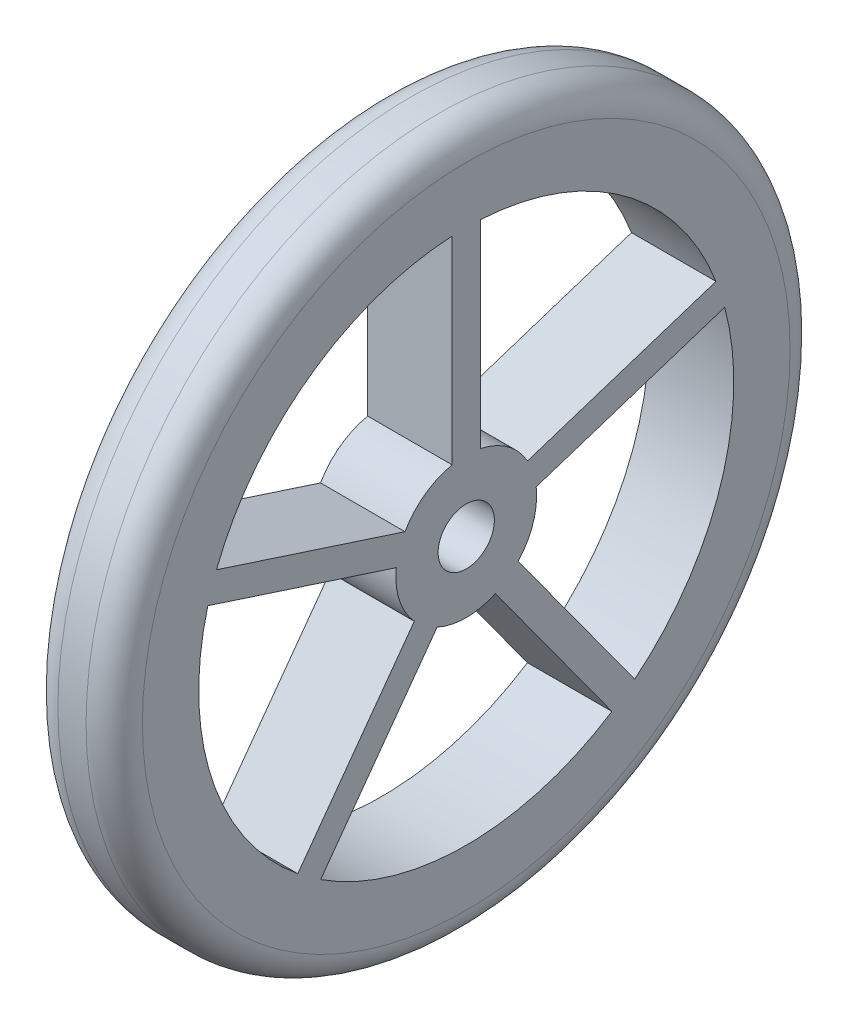
ISO-10303-21;
HEADER;
FILE_DESCRIPTION(('STEP AP214'),'2;1');
FILE_NAME('part.step','',(''),(''),'','','');
FILE_SCHEMA(('AUTOMOTIVE_DESIGN { 1 0 10303 214 1 1 1 1 }'));
ENDSEC;
DATA;
#1=APPLICATION_CONTEXT('core data for automotive mechanical design processes');
#2=APPLICATION_PROTOCOL_DEFINITION('international standard','automotive_design',2000,#1);
#3=PRODUCT_CONTEXT('',#1,'mechanical');
#4=PRODUCT('Part','Part','',(#3));
#5=PRODUCT_RELATED_PRODUCT_CATEGORY('part','',(#4));
#6=PRODUCT_DEFINITION_FORMATION('','',#4);
#7=PRODUCT_DEFINITION_CONTEXT('part definition',#1,'design');
#8=PRODUCT_DEFINITION('design','',#6,#7);
#9=PRODUCT_DEFINITION_SHAPE('','',#8);
#10=(LENGTH_UNIT() NAMED_UNIT(*) SI_UNIT(.MILLI.,.METRE.));
#11=(NAMED_UNIT(*) PLANE_ANGLE_UNIT() SI_UNIT($,.RADIAN.));
#12=(NAMED_UNIT(*) SI_UNIT($,.STERADIAN.) SOLID_ANGLE_UNIT());
#13=UNCERTAINTY_MEASURE_WITH_UNIT(LENGTH_MEASURE(1.E-05),#10,'distance_accuracy_value','');
#14=(GEOMETRIC_REPRESENTATION_CONTEXT(3) GLOBAL_UNCERTAINTY_ASSIGNED_CONTEXT((#13)) GLOBAL_UNIT_ASSIGNED_CONTEXT((#10,
#11,#12)) REPRESENTATION_CONTEXT('',''));
#15=CARTESIAN_POINT('',(0.,0.,0.));
#16=DIRECTION('',(0.,0.,1.));
#17=DIRECTION('',(1.,0.,0.));
#18=AXIS2_PLACEMENT_3D('',#15,#16,#17);
#19=CARTESIAN_POINT('',(60.,0.,0.));
#20=DIRECTION('',(1.,0.,0.));
#21=DIRECTION('',(0.,0.,-1.));
#22=AXIS2_PLACEMENT_3D('',#19,#20,#21);
#23=PLANE('',#22);
#24=CARTESIAN_POINT('',(60.,0.,0.));
#25=DIRECTION('',(1.,0.,0.));
#26=DIRECTION('',(0.,0.,-1.));
#27=AXIS2_PLACEMENT_3D('',#24,#25,#26);
#28=CIRCLE('',#27,230.);
#29=CARTESIAN_POINT('',(60.,0.,-230.));
#30=VERTEX_POINT('',#29);
#31=EDGE_CURVE('E11',#30,#30,#28,.T.);
#32=ORIENTED_EDGE('',*,*,#31,.T.);
#33=EDGE_LOOP('',(#32));
#34=FACE_BOUND('',#33,.T.);
#35=CARTESIAN_POINT('',(60.,0.,0.));
#36=DIRECTION('',(1.,0.,0.));
#37=DIRECTION('',(0.,0.,-1.));
#38=AXIS2_PLACEMENT_3D('',#35,#36,#37);
#39=CIRCLE('',#38,20.);
#40=CARTESIAN_POINT('',(60.,0.,-20.));
#41=VERTEX_POINT('',#40);
#42=EDGE_CURVE('E330',#41,#41,#39,.T.);
#43=ORIENTED_EDGE('',*,*,#42,.F.);
#44=EDGE_LOOP('',(#43));
#45=FACE_BOUND('',#44,.T.);
#46=DIRECTION('',(0.,0.309016994374948,-0.951056516295153));
#47=VECTOR('',#46,1.);
#48=CARTESIAN_POINT('',(60.,68.1424174384113,-177.360116558513));
#49=LINE('',#48,#47);
#50=CARTESIAN_POINT('',(60.,24.6492443242971,-43.5018936856903));
#51=VERTEX_POINT('',#50);
#52=CARTESIAN_POINT('',(60.,68.1424174384113,-177.360116558513));
#53=VERTEX_POINT('',#52);
#54=EDGE_CURVE('E301',#51,#53,#49,.T.);
#55=ORIENTED_EDGE('',*,*,#54,.F.);
#56=CARTESIAN_POINT('',(60.,0.,0.));
#57=DIRECTION('',(-1.,0.,0.));
#58=DIRECTION('',(0.,0.,-1.));
#59=AXIS2_PLACEMENT_3D('',#56,#57,#58);
#60=CIRCLE('',#59,50.);
#61=CARTESIAN_POINT('',(60.,48.9897948556636,-10.));
#62=VERTEX_POINT('',#61);
#63=EDGE_CURVE('E299',#62,#51,#60,.T.);
#64=ORIENTED_EDGE('',*,*,#63,.F.);
#65=DIRECTION('',(0.,-1.,0.));
#66=VECTOR('',#65,1.);
#67=CARTESIAN_POINT('',(60.,189.736659610103,-9.99999999999998));
#68=LINE('',#67,#66);
#69=CARTESIAN_POINT('',(60.,189.736659610103,-9.99999999999998));
#70=VERTEX_POINT('',#69);
#71=EDGE_CURVE('E307',#70,#62,#68,.T.);
#72=ORIENTED_EDGE('',*,*,#71,.F.);
#73=CARTESIAN_POINT('',(60.,0.,0.));
#74=DIRECTION('',(1.,0.,0.));
#75=DIRECTION('',(0.,0.,-1.));
#76=AXIS2_PLACEMENT_3D('',#73,#74,#75);
#77=CIRCLE('',#76,190.);
#78=EDGE_CURVE('E304',#53,#70,#77,.T.);
#79=ORIENTED_EDGE('',*,*,#78,.F.);
#80=EDGE_LOOP('',(#55,#64,#72,#79));
#81=FACE_BOUND('',#80,.T.);
#82=DIRECTION('',(0.,1.,0.));
#83=VECTOR('',#82,1.);
#84=CARTESIAN_POINT('',(60.,189.736659610103,10.));
#85=LINE('',#84,#83);
#86=CARTESIAN_POINT('',(60.,48.9897948556636,10.));
#87=VERTEX_POINT('',#86);
#88=CARTESIAN_POINT('',(60.,189.736659610103,10.));
#89=VERTEX_POINT('',#88);
#90=EDGE_CURVE('E270',#87,#89,#85,.T.);
#91=ORIENTED_EDGE('',*,*,#90,.F.);
#92=CARTESIAN_POINT('',(60.,0.,0.));
#93=DIRECTION('',(-1.,0.,0.));
#94=DIRECTION('',(0.,0.,-1.));
#95=AXIS2_PLACEMENT_3D('',#92,#93,#94);
#96=CIRCLE('',#95,50.);
#97=CARTESIAN_POINT('',(60.,24.6492443242939,43.5018936856922));
#98=VERTEX_POINT('',#97);
#99=EDGE_CURVE('E268',#98,#87,#96,.T.);
#100=ORIENTED_EDGE('',*,*,#99,.F.);
#101=DIRECTION('',(0.,-0.309016994374947,-0.951056516295154));
#102=VECTOR('',#101,1.);
#103=CARTESIAN_POINT('',(60.,68.1424174384079,177.360116558514));
#104=LINE('',#103,#102);
#105=CARTESIAN_POINT('',(60.,68.1424174384079,177.360116558514));
#106=VERTEX_POINT('',#105);
#107=EDGE_CURVE('E276',#106,#98,#104,.T.);
#108=ORIENTED_EDGE('',*,*,#107,.F.);
#109=CARTESIAN_POINT('',(60.,0.,0.));
#110=DIRECTION('',(1.,0.,0.));
#111=DIRECTION('',(0.,0.,-1.));
#112=AXIS2_PLACEMENT_3D('',#109,#110,#111);
#113=CIRCLE('',#112,190.);
#114=EDGE_CURVE('E273',#89,#106,#113,.T.);
#115=ORIENTED_EDGE('',*,*,#114,.F.);
#116=EDGE_LOOP('',(#91,#100,#108,#115));
#117=FACE_BOUND('',#116,.T.);
#118=DIRECTION('',(0.,-0.809016994374947,-0.587785252292473));
#119=VECTOR('',#118,1.);
#120=CARTESIAN_POINT('',(60.,-147.622329557581,-119.614580281808));
#121=LINE('',#120,#119);
#122=CARTESIAN_POINT('',(60.,-33.7557240662468,-36.8856488727447));
#123=VERTEX_POINT('',#122);
#124=CARTESIAN_POINT('',(60.,-147.622329557581,-119.614580281808));
#125=VERTEX_POINT('',#124);
#126=EDGE_CURVE('E239',#123,#125,#121,.T.);
#127=ORIENTED_EDGE('',*,*,#126,.F.);
#128=CARTESIAN_POINT('',(60.,0.,0.));
#129=DIRECTION('',(-1.,0.,0.));
#130=DIRECTION('',(0.,0.,-1.));
#131=AXIS2_PLACEMENT_3D('',#128,#129,#130);
#132=CIRCLE('',#131,50.);
#133=CARTESIAN_POINT('',(60.,5.62811399839088,-49.6822335731911));
#134=VERTEX_POINT('',#133);
#135=EDGE_CURVE('E237',#134,#123,#132,.T.);
#136=ORIENTED_EDGE('',*,*,#135,.F.);
#137=DIRECTION('',(0.,-0.309016994374948,0.951056516295154));
#138=VECTOR('',#137,1.);
#139=CARTESIAN_POINT('',(60.,49.1212871125049,-183.540456446013));
#140=LINE('',#139,#138);
#141=CARTESIAN_POINT('',(60.,49.1212871125049,-183.540456446013));
#142=VERTEX_POINT('',#141);
#143=EDGE_CURVE('E245',#142,#134,#140,.T.);
#144=ORIENTED_EDGE('',*,*,#143,.F.);
#145=CARTESIAN_POINT('',(60.,0.,0.));
#146=DIRECTION('',(1.,0.,0.));
#147=DIRECTION('',(0.,0.,-1.));
#148=AXIS2_PLACEMENT_3D('',#145,#146,#147);
#149=CIRCLE('',#148,190.);
#150=EDGE_CURVE('E242',#125,#142,#149,.T.);
#151=ORIENTED_EDGE('',*,*,#150,.F.);
#152=EDGE_LOOP('',(#127,#136,#144,#151));
#153=FACE_BOUND('',#152,.T.);
#154=DIRECTION('',(0.,-0.809016994374948,0.587785252292473));
#155=VECTOR('',#154,1.);
#156=CARTESIAN_POINT('',(60.,-159.378034603435,103.434240394303));
#157=LINE('',#156,#155);
#158=CARTESIAN_POINT('',(60.,-45.5114291121005,20.7053089852399));
#159=VERTEX_POINT('',#158);
#160=CARTESIAN_POINT('',(60.,-159.378034603434,103.434240394303));
#161=VERTEX_POINT('',#160);
#162=EDGE_CURVE('E208',#159,#161,#157,.T.);
#163=ORIENTED_EDGE('',*,*,#162,.F.);
#164=CARTESIAN_POINT('',(60.,0.,0.));
#165=DIRECTION('',(-1.,0.,0.));
#166=DIRECTION('',(0.,0.,-1.));
#167=AXIS2_PLACEMENT_3D('',#164,#165,#166);
#168=CIRCLE('',#167,50.);
#169=CARTESIAN_POINT('',(60.,-45.5114291120989,-20.7053089852432));
#170=VERTEX_POINT('',#169);
#171=EDGE_CURVE('E206',#170,#159,#168,.T.);
#172=ORIENTED_EDGE('',*,*,#171,.F.);
#173=DIRECTION('',(0.,0.809016994374947,0.587785252292473));
#174=VECTOR('',#173,1.);
#175=CARTESIAN_POINT('',(60.,-159.378034603432,-103.434240394306));
#176=LINE('',#175,#174);
#177=CARTESIAN_POINT('',(60.,-159.378034603432,-103.434240394306));
#178=VERTEX_POINT('',#177);
#179=EDGE_CURVE('E214',#178,#170,#176,.T.);
#180=ORIENTED_EDGE('',*,*,#179,.F.);
#181=CARTESIAN_POINT('',(60.,0.,0.));
#182=DIRECTION('',(1.,0.,0.));
#183=DIRECTION('',(0.,0.,-1.));
#184=AXIS2_PLACEMENT_3D('',#181,#182,#183);
#185=CIRCLE('',#184,190.);
#186=EDGE_CURVE('E211',#161,#178,#185,.T.);
#187=ORIENTED_EDGE('',*,*,#186,.F.);
#188=EDGE_LOOP('',(#163,#172,#180,#187));
#189=FACE_BOUND('',#188,.T.);
#190=DIRECTION('',(0.,0.309016994374947,0.951056516295154));
#191=VECTOR('',#190,1.);
#192=CARTESIAN_POINT('',(60.,49.1212871125014,183.540456446014));
#193=LINE('',#192,#191);
#194=CARTESIAN_POINT('',(60.,5.62811399838723,49.6822335731915));
#195=VERTEX_POINT('',#194);
#196=CARTESIAN_POINT('',(60.,49.1212871125014,183.540456446014));
#197=VERTEX_POINT('',#196);
#198=EDGE_CURVE('E178',#195,#197,#193,.T.);
#199=ORIENTED_EDGE('',*,*,#198,.F.);
#200=CARTESIAN_POINT('',(60.,0.,0.));
#201=DIRECTION('',(-1.,0.,0.));
#202=DIRECTION('',(0.,0.,-1.));
#203=AXIS2_PLACEMENT_3D('',#200,#201,#202);
#204=CIRCLE('',#203,50.);
#205=CARTESIAN_POINT('',(60.,-33.7557240662495,36.8856488727422));
#206=VERTEX_POINT('',#205);
#207=EDGE_CURVE('E170',#206,#195,#204,.T.);
#208=ORIENTED_EDGE('',*,*,#207,.F.);
#209=DIRECTION('',(0.,0.809016994374948,-0.587785252292473));
#210=VECTOR('',#209,1.);
#211=CARTESIAN_POINT('',(60.,-147.622329557583,119.614580281805));
#212=LINE('',#211,#210);
#213=CARTESIAN_POINT('',(60.,-147.622329557583,119.614580281805));
#214=VERTEX_POINT('',#213);
#215=EDGE_CURVE('E192',#214,#206,#212,.T.);
#216=ORIENTED_EDGE('',*,*,#215,.F.);
#217=CARTESIAN_POINT('',(60.,0.,0.));
#218=DIRECTION('',(1.,0.,0.));
#219=DIRECTION('',(0.,0.,-1.));
#220=AXIS2_PLACEMENT_3D('',#217,#218,#219);
#221=CIRCLE('',#220,190.);
#222=EDGE_CURVE('E190',#197,#214,#221,.T.);
#223=ORIENTED_EDGE('',*,*,#222,.F.);
#224=EDGE_LOOP('',(#199,#208,#216,#223));
#225=FACE_BOUND('',#224,.T.);
#226=ADVANCED_FACE('F33',(#34,#45,#81,#117,#153,#189,#225),#23,.T.);
#227=CARTESIAN_POINT('',(0.,0.,0.));
#228=DIRECTION('',(1.,0.,0.));
#229=DIRECTION('',(0.,0.,-1.));
#230=AXIS2_PLACEMENT_3D('',#227,#228,#229);
#231=PLANE('',#230);
#232=CARTESIAN_POINT('',(0.,0.,0.));
#233=DIRECTION('',(1.,0.,0.));
#234=DIRECTION('',(0.,0.,-1.));
#235=AXIS2_PLACEMENT_3D('',#232,#233,#234);
#236=CIRCLE('',#235,230.);
#237=CARTESIAN_POINT('',(0.,0.,-230.));
#238=VERTEX_POINT('',#237);
#239=EDGE_CURVE('E41',#238,#238,#236,.F.);
#240=ORIENTED_EDGE('',*,*,#239,.T.);
#241=EDGE_LOOP('',(#240));
#242=FACE_BOUND('',#241,.T.);
#243=CARTESIAN_POINT('',(0.,0.,0.));
#244=DIRECTION('',(-1.,0.,0.));
#245=DIRECTION('',(0.,0.,-1.));
#246=AXIS2_PLACEMENT_3D('',#243,#244,#245);
#247=CIRCLE('',#246,50.);
#248=CARTESIAN_POINT('',(0.,-45.5114291120989,-20.7053089852432));
#249=VERTEX_POINT('',#248);
#250=CARTESIAN_POINT('',(0.,-45.5114291121005,20.7053089852399));
#251=VERTEX_POINT('',#250);
#252=EDGE_CURVE('E186',#249,#251,#247,.T.);
#253=ORIENTED_EDGE('',*,*,#252,.T.);
#254=DIRECTION('',(0.,-0.809016994374948,0.587785252292473));
#255=VECTOR('',#254,1.);
#256=CARTESIAN_POINT('',(0.,-159.378034603435,103.434240394303));
#257=LINE('',#256,#255);
#258=CARTESIAN_POINT('',(0.,-159.378034603434,103.434240394303));
#259=VERTEX_POINT('',#258);
#260=EDGE_CURVE('E219',#251,#259,#257,.T.);
#261=ORIENTED_EDGE('',*,*,#260,.T.);
#262=CARTESIAN_POINT('',(0.,0.,0.));
#263=DIRECTION('',(1.,0.,0.));
#264=DIRECTION('',(0.,0.,-1.));
#265=AXIS2_PLACEMENT_3D('',#262,#263,#264);
#266=CIRCLE('',#265,190.);
#267=CARTESIAN_POINT('',(0.,-159.378034603432,-103.434240394306));
#268=VERTEX_POINT('',#267);
#269=EDGE_CURVE('E222',#259,#268,#266,.T.);
#270=ORIENTED_EDGE('',*,*,#269,.T.);
#271=DIRECTION('',(0.,0.809016994374947,0.587785252292473));
#272=VECTOR('',#271,1.);
#273=CARTESIAN_POINT('',(0.,-159.378034603432,-103.434240394306));
#274=LINE('',#273,#272);
#275=EDGE_CURVE('E209',#268,#249,#274,.T.);
#276=ORIENTED_EDGE('',*,*,#275,.T.);
#277=EDGE_LOOP('',(#253,#261,#270,#276));
#278=FACE_BOUND('',#277,.T.);
#279=CARTESIAN_POINT('',(0.,0.,0.));
#280=DIRECTION('',(-1.,0.,0.));
#281=DIRECTION('',(0.,0.,-1.));
#282=AXIS2_PLACEMENT_3D('',#279,#280,#281);
#283=CIRCLE('',#282,50.);
#284=CARTESIAN_POINT('',(0.,24.6492443242939,43.5018936856922));
#285=VERTEX_POINT('',#284);
#286=CARTESIAN_POINT('',(0.,48.9897948556636,10.));
#287=VERTEX_POINT('',#286);
#288=EDGE_CURVE('E267',#285,#287,#283,.T.);
#289=ORIENTED_EDGE('',*,*,#288,.T.);
#290=DIRECTION('',(0.,1.,0.));
#291=VECTOR('',#290,1.);
#292=CARTESIAN_POINT('',(0.,189.736659610103,10.));
#293=LINE('',#292,#291);
#294=CARTESIAN_POINT('',(0.,189.736659610103,10.));
#295=VERTEX_POINT('',#294);
#296=EDGE_CURVE('E281',#287,#295,#293,.T.);
#297=ORIENTED_EDGE('',*,*,#296,.T.);
#298=CARTESIAN_POINT('',(0.,0.,0.));
#299=DIRECTION('',(1.,0.,0.));
#300=DIRECTION('',(0.,0.,-1.));
#301=AXIS2_PLACEMENT_3D('',#298,#299,#300);
#302=CIRCLE('',#301,190.);
#303=CARTESIAN_POINT('',(0.,68.142417438408,177.360116558514));
#304=VERTEX_POINT('',#303);
#305=EDGE_CURVE('E284',#295,#304,#302,.T.);
#306=ORIENTED_EDGE('',*,*,#305,.T.);
#307=DIRECTION('',(0.,-0.309016994374947,-0.951056516295154));
#308=VECTOR('',#307,1.);
#309=CARTESIAN_POINT('',(0.,68.1424174384079,177.360116558514));
#310=LINE('',#309,#308);
#311=EDGE_CURVE('E271',#304,#285,#310,.T.);
#312=ORIENTED_EDGE('',*,*,#311,.T.);
#313=EDGE_LOOP('',(#289,#297,#306,#312));
#314=FACE_BOUND('',#313,.T.);
#315=CARTESIAN_POINT('',(0.,0.,0.));
#316=DIRECTION('',(1.,0.,0.));
#317=DIRECTION('',(0.,0.,-1.));
#318=AXIS2_PLACEMENT_3D('',#315,#316,#317);
#319=CIRCLE('',#318,20.);
#320=CARTESIAN_POINT('',(0.,0.,-20.));
#321=VERTEX_POINT('',#320);
#322=EDGE_CURVE('E329',#321,#321,#319,.T.);
#323=ORIENTED_EDGE('',*,*,#322,.T.);
#324=EDGE_LOOP('',(#323));
#325=FACE_BOUND('',#324,.T.);
#326=CARTESIAN_POINT('',(0.,0.,0.));
#327=DIRECTION('',(-1.,0.,0.));
#328=DIRECTION('',(0.,0.,-1.));
#329=AXIS2_PLACEMENT_3D('',#326,#327,#328);
#330=CIRCLE('',#329,50.);
#331=CARTESIAN_POINT('',(0.,48.9897948556636,-10.));
#332=VERTEX_POINT('',#331);
#333=CARTESIAN_POINT('',(0.,24.6492443242971,-43.5018936856903));
#334=VERTEX_POINT('',#333);
#335=EDGE_CURVE('E298',#332,#334,#330,.T.);
#336=ORIENTED_EDGE('',*,*,#335,.T.);
#337=DIRECTION('',(0.,0.309016994374948,-0.951056516295153));
#338=VECTOR('',#337,1.);
#339=CARTESIAN_POINT('',(0.,68.1424174384113,-177.360116558513));
#340=LINE('',#339,#338);
#341=CARTESIAN_POINT('',(0.,68.1424174384113,-177.360116558513));
#342=VERTEX_POINT('',#341);
#343=EDGE_CURVE('E312',#334,#342,#340,.T.);
#344=ORIENTED_EDGE('',*,*,#343,.T.);
#345=CARTESIAN_POINT('',(0.,0.,0.));
#346=DIRECTION('',(1.,0.,0.));
#347=DIRECTION('',(0.,0.,-1.));
#348=AXIS2_PLACEMENT_3D('',#345,#346,#347);
#349=CIRCLE('',#348,190.);
#350=CARTESIAN_POINT('',(0.,189.736659610103,-9.99999999999998));
#351=VERTEX_POINT('',#350);
#352=EDGE_CURVE('E315',#342,#351,#349,.T.);
#353=ORIENTED_EDGE('',*,*,#352,.T.);
#354=DIRECTION('',(0.,-1.,0.));
#355=VECTOR('',#354,1.);
#356=CARTESIAN_POINT('',(0.,189.736659610103,-9.99999999999998));
#357=LINE('',#356,#355);
#358=EDGE_CURVE('E302',#351,#332,#357,.T.);
#359=ORIENTED_EDGE('',*,*,#358,.T.);
#360=EDGE_LOOP('',(#336,#344,#353,#359));
#361=FACE_BOUND('',#360,.T.);
#362=CARTESIAN_POINT('',(0.,0.,0.));
#363=DIRECTION('',(-1.,0.,0.));
#364=DIRECTION('',(0.,0.,-1.));
#365=AXIS2_PLACEMENT_3D('',#362,#363,#364);
#366=CIRCLE('',#365,50.);
#367=CARTESIAN_POINT('',(0.,5.62811399839088,-49.6822335731911));
#368=VERTEX_POINT('',#367);
#369=CARTESIAN_POINT('',(0.,-33.7557240662468,-36.8856488727447));
#370=VERTEX_POINT('',#369);
#371=EDGE_CURVE('E236',#368,#370,#366,.T.);
#372=ORIENTED_EDGE('',*,*,#371,.T.);
#373=DIRECTION('',(0.,-0.809016994374947,-0.587785252292473));
#374=VECTOR('',#373,1.);
#375=CARTESIAN_POINT('',(0.,-147.622329557581,-119.614580281808));
#376=LINE('',#375,#374);
#377=CARTESIAN_POINT('',(0.,-147.622329557581,-119.614580281808));
#378=VERTEX_POINT('',#377);
#379=EDGE_CURVE('E250',#370,#378,#376,.T.);
#380=ORIENTED_EDGE('',*,*,#379,.T.);
#381=CARTESIAN_POINT('',(0.,0.,0.));
#382=DIRECTION('',(1.,0.,0.));
#383=DIRECTION('',(0.,0.,-1.));
#384=AXIS2_PLACEMENT_3D('',#381,#382,#383);
#385=CIRCLE('',#384,190.);
#386=CARTESIAN_POINT('',(0.,49.1212871125049,-183.540456446013));
#387=VERTEX_POINT('',#386);
#388=EDGE_CURVE('E253',#378,#387,#385,.T.);
#389=ORIENTED_EDGE('',*,*,#388,.T.);
#390=DIRECTION('',(0.,-0.309016994374948,0.951056516295154));
#391=VECTOR('',#390,1.);
#392=CARTESIAN_POINT('',(0.,49.1212871125049,-183.540456446013));
#393=LINE('',#392,#391);
#394=EDGE_CURVE('E240',#387,#368,#393,.T.);
#395=ORIENTED_EDGE('',*,*,#394,.T.);
#396=EDGE_LOOP('',(#372,#380,#389,#395));
#397=FACE_BOUND('',#396,.T.);
#398=CARTESIAN_POINT('',(0.,0.,0.));
#399=DIRECTION('',(-1.,0.,0.));
#400=DIRECTION('',(0.,0.,-1.));
#401=AXIS2_PLACEMENT_3D('',#398,#399,#400);
#402=CIRCLE('',#401,50.);
#403=CARTESIAN_POINT('',(0.,-33.7557240662495,36.8856488727422));
#404=VERTEX_POINT('',#403);
#405=CARTESIAN_POINT('',(0.,5.62811399838723,49.6822335731915));
#406=VERTEX_POINT('',#405);
#407=EDGE_CURVE('E56',#404,#406,#402,.T.);
#408=ORIENTED_EDGE('',*,*,#407,.T.);
#409=DIRECTION('',(0.,0.309016994374947,0.951056516295154));
#410=VECTOR('',#409,1.);
#411=CARTESIAN_POINT('',(0.,49.1212871125014,183.540456446014));
#412=LINE('',#411,#410);
#413=CARTESIAN_POINT('',(0.,49.1212871125014,183.540456446014));
#414=VERTEX_POINT('',#413);
#415=EDGE_CURVE('E185',#406,#414,#412,.T.);
#416=ORIENTED_EDGE('',*,*,#415,.T.);
#417=CARTESIAN_POINT('',(0.,0.,0.));
#418=DIRECTION('',(1.,0.,0.));
#419=DIRECTION('',(0.,0.,-1.));
#420=AXIS2_PLACEMENT_3D('',#417,#418,#419);
#421=CIRCLE('',#420,190.);
#422=CARTESIAN_POINT('',(0.,-147.622329557583,119.614580281805));
#423=VERTEX_POINT('',#422);
#424=EDGE_CURVE('E198',#414,#423,#421,.T.);
#425=ORIENTED_EDGE('',*,*,#424,.T.);
#426=DIRECTION('',(0.,0.809016994374948,-0.587785252292473));
#427=VECTOR('',#426,1.);
#428=CARTESIAN_POINT('',(0.,-147.622329557583,119.614580281805));
#429=LINE('',#428,#427);
#430=EDGE_CURVE('E179',#423,#404,#429,.T.);
#431=ORIENTED_EDGE('',*,*,#430,.T.);
#432=EDGE_LOOP('',(#408,#416,#425,#431));
#433=FACE_BOUND('',#432,.T.);
#434=ADVANCED_FACE('F343',(#242,#278,#314,#325,#361,#397,#433),#231,.F.);
#435=CARTESIAN_POINT('',(60.,0.,0.));
#436=DIRECTION('',(-1.,0.,0.));
#437=DIRECTION('',(0.,0.,1.));
#438=AXIS2_PLACEMENT_3D('',#435,#436,#437);
#439=CYLINDRICAL_SURFACE('',#438,250.);
#440=CARTESIAN_POINT('',(20.,0.,0.));
#441=DIRECTION('',(1.,0.,0.));
#442=DIRECTION('',(0.,0.,-1.));
#443=AXIS2_PLACEMENT_3D('',#440,#441,#442);
#444=CIRCLE('',#443,250.);
#445=CARTESIAN_POINT('',(20.,0.,-250.));
#446=VERTEX_POINT('',#445);
#447=EDGE_CURVE('E338',#446,#446,#444,.T.);
#448=ORIENTED_EDGE('',*,*,#447,.T.);
#449=EDGE_LOOP('',(#448));
#450=FACE_BOUND('',#449,.T.);
#451=CARTESIAN_POINT('',(40.,0.,0.));
#452=DIRECTION('',(1.,0.,0.));
#453=DIRECTION('',(0.,0.,-1.));
#454=AXIS2_PLACEMENT_3D('',#451,#452,#453);
#455=CIRCLE('',#454,250.);
#456=CARTESIAN_POINT('',(40.,0.,-250.));
#457=VERTEX_POINT('',#456);
#458=EDGE_CURVE('E333',#457,#457,#455,.F.);
#459=ORIENTED_EDGE('',*,*,#458,.T.);
#460=EDGE_LOOP('',(#459));
#461=FACE_BOUND('',#460,.T.);
#462=ADVANCED_FACE('F352',(#450,#461),#439,.T.);
#463=CARTESIAN_POINT('',(60.,0.,0.));
#464=DIRECTION('',(-1.,0.,0.));
#465=DIRECTION('',(0.,0.,1.));
#466=AXIS2_PLACEMENT_3D('',#463,#464,#465);
#467=CYLINDRICAL_SURFACE('',#466,20.);
#468=ORIENTED_EDGE('',*,*,#42,.T.);
#469=EDGE_LOOP('',(#468));
#470=FACE_BOUND('',#469,.T.);
#471=ORIENTED_EDGE('',*,*,#322,.F.);
#472=EDGE_LOOP('',(#471));
#473=FACE_BOUND('',#472,.T.);
#474=ADVANCED_FACE('F355',(#470,#473),#467,.F.);
#475=CARTESIAN_POINT('',(60.,0.,0.));
#476=DIRECTION('',(-1.,0.,0.));
#477=DIRECTION('',(0.,0.,1.));
#478=AXIS2_PLACEMENT_3D('',#475,#476,#477);
#479=CYLINDRICAL_SURFACE('',#478,50.);
#480=ORIENTED_EDGE('',*,*,#335,.F.);
#481=DIRECTION('',(-1.,0.,0.));
#482=VECTOR('',#481,1.);
#483=CARTESIAN_POINT('',(60.,48.9897948556636,-10.));
#484=LINE('',#483,#482);
#485=EDGE_CURVE('E309',#62,#332,#484,.T.);
#486=ORIENTED_EDGE('',*,*,#485,.F.);
#487=ORIENTED_EDGE('',*,*,#63,.T.);
#488=DIRECTION('',(-1.,0.,0.));
#489=VECTOR('',#488,1.);
#490=CARTESIAN_POINT('',(60.,24.6492443242971,-43.5018936856903));
#491=LINE('',#490,#489);
#492=EDGE_CURVE('E326',#51,#334,#491,.T.);
#493=ORIENTED_EDGE('',*,*,#492,.T.);
#494=EDGE_LOOP('',(#480,#486,#487,#493));
#495=FACE_BOUND('',#494,.T.);
#496=ADVANCED_FACE('F455',(#495),#479,.T.);
#497=CARTESIAN_POINT('',(60.,68.1424174384113,-177.360116558513));
#498=DIRECTION('',(0.,0.951056516295153,0.309016994374948));
#499=DIRECTION('',(0.,-0.309016994374948,0.951056516295154));
#500=AXIS2_PLACEMENT_3D('',#497,#498,#499);
#501=PLANE('',#500);
#502=ORIENTED_EDGE('',*,*,#343,.F.);
#503=ORIENTED_EDGE('',*,*,#492,.F.);
#504=ORIENTED_EDGE('',*,*,#54,.T.);
#505=DIRECTION('',(-1.,0.,0.));
#506=VECTOR('',#505,1.);
#507=CARTESIAN_POINT('',(60.,68.1424174384113,-177.360116558513));
#508=LINE('',#507,#506);
#509=EDGE_CURVE('E324',#53,#342,#508,.T.);
#510=ORIENTED_EDGE('',*,*,#509,.T.);
#511=EDGE_LOOP('',(#502,#503,#504,#510));
#512=FACE_BOUND('',#511,.T.);
#513=ADVANCED_FACE('F451',(#512),#501,.T.);
#514=CARTESIAN_POINT('',(60.,0.,0.));
#515=DIRECTION('',(-1.,0.,0.));
#516=DIRECTION('',(0.,0.,1.));
#517=AXIS2_PLACEMENT_3D('',#514,#515,#516);
#518=CYLINDRICAL_SURFACE('',#517,190.);
#519=ORIENTED_EDGE('',*,*,#352,.F.);
#520=ORIENTED_EDGE('',*,*,#509,.F.);
#521=ORIENTED_EDGE('',*,*,#78,.T.);
#522=DIRECTION('',(-1.,0.,0.));
#523=VECTOR('',#522,1.);
#524=CARTESIAN_POINT('',(60.,189.736659610103,-9.99999999999998));
#525=LINE('',#524,#523);
#526=EDGE_CURVE('E322',#70,#351,#525,.T.);
#527=ORIENTED_EDGE('',*,*,#526,.T.);
#528=EDGE_LOOP('',(#519,#520,#521,#527));
#529=FACE_BOUND('',#528,.T.);
#530=ADVANCED_FACE('F447',(#529),#518,.F.);
#531=CARTESIAN_POINT('',(60.,189.736659610103,-9.99999999999998));
#532=DIRECTION('',(0.,0.,-1.));
#533=DIRECTION('',(0.,1.,0.));
#534=AXIS2_PLACEMENT_3D('',#531,#532,#533);
#535=PLANE('',#534);
#536=ORIENTED_EDGE('',*,*,#358,.F.);
#537=ORIENTED_EDGE('',*,*,#526,.F.);
#538=ORIENTED_EDGE('',*,*,#71,.T.);
#539=ORIENTED_EDGE('',*,*,#485,.T.);
#540=EDGE_LOOP('',(#536,#537,#538,#539));
#541=FACE_BOUND('',#540,.T.);
#542=ADVANCED_FACE('F443',(#541),#535,.T.);
#543=CARTESIAN_POINT('',(60.,0.,0.));
#544=DIRECTION('',(-1.,0.,0.));
#545=DIRECTION('',(0.,0.,1.));
#546=AXIS2_PLACEMENT_3D('',#543,#544,#545);
#547=CYLINDRICAL_SURFACE('',#546,50.);
#548=ORIENTED_EDGE('',*,*,#288,.F.);
#549=DIRECTION('',(-1.,0.,0.));
#550=VECTOR('',#549,1.);
#551=CARTESIAN_POINT('',(60.,24.6492443242939,43.5018936856922));
#552=LINE('',#551,#550);
#553=EDGE_CURVE('E278',#98,#285,#552,.T.);
#554=ORIENTED_EDGE('',*,*,#553,.F.);
#555=ORIENTED_EDGE('',*,*,#99,.T.);
#556=DIRECTION('',(-1.,0.,0.));
#557=VECTOR('',#556,1.);
#558=CARTESIAN_POINT('',(60.,48.9897948556636,10.));
#559=LINE('',#558,#557);
#560=EDGE_CURVE('E295',#87,#287,#559,.T.);
#561=ORIENTED_EDGE('',*,*,#560,.T.);
#562=EDGE_LOOP('',(#548,#554,#555,#561));
#563=FACE_BOUND('',#562,.T.);
#564=ADVANCED_FACE('F439',(#563),#547,.T.);
#565=CARTESIAN_POINT('',(60.,189.736659610103,10.));
#566=DIRECTION('',(0.,0.,1.));
#567=DIRECTION('',(0.,-1.,0.));
#568=AXIS2_PLACEMENT_3D('',#565,#566,#567);
#569=PLANE('',#568);
#570=ORIENTED_EDGE('',*,*,#296,.F.);
#571=ORIENTED_EDGE('',*,*,#560,.F.);
#572=ORIENTED_EDGE('',*,*,#90,.T.);
#573=DIRECTION('',(-1.,0.,0.));
#574=VECTOR('',#573,1.);
#575=CARTESIAN_POINT('',(60.,189.736659610103,10.));
#576=LINE('',#575,#574);
#577=EDGE_CURVE('E293',#89,#295,#576,.T.);
#578=ORIENTED_EDGE('',*,*,#577,.T.);
#579=EDGE_LOOP('',(#570,#571,#572,#578));
#580=FACE_BOUND('',#579,.T.);
#581=ADVANCED_FACE('F435',(#580),#569,.T.);
#582=CARTESIAN_POINT('',(60.,0.,0.));
#583=DIRECTION('',(-1.,0.,0.));
#584=DIRECTION('',(0.,0.,1.));
#585=AXIS2_PLACEMENT_3D('',#582,#583,#584);
#586=CYLINDRICAL_SURFACE('',#585,190.);
#587=ORIENTED_EDGE('',*,*,#305,.F.);
#588=ORIENTED_EDGE('',*,*,#577,.F.);
#589=ORIENTED_EDGE('',*,*,#114,.T.);
#590=DIRECTION('',(-1.,0.,0.));
#591=VECTOR('',#590,1.);
#592=CARTESIAN_POINT('',(60.,68.142417438408,177.360116558514));
#593=LINE('',#592,#591);
#594=EDGE_CURVE('E291',#106,#304,#593,.T.);
#595=ORIENTED_EDGE('',*,*,#594,.T.);
#596=EDGE_LOOP('',(#587,#588,#589,#595));
#597=FACE_BOUND('',#596,.T.);
#598=ADVANCED_FACE('F431',(#597),#586,.F.);
#599=CARTESIAN_POINT('',(60.,68.1424174384079,177.360116558514));
#600=DIRECTION('',(0.,0.951056516295154,-0.309016994374947));
#601=DIRECTION('',(0.,0.309016994374947,0.951056516295154));
#602=AXIS2_PLACEMENT_3D('',#599,#600,#601);
#603=PLANE('',#602);
#604=ORIENTED_EDGE('',*,*,#311,.F.);
#605=ORIENTED_EDGE('',*,*,#594,.F.);
#606=ORIENTED_EDGE('',*,*,#107,.T.);
#607=ORIENTED_EDGE('',*,*,#553,.T.);
#608=EDGE_LOOP('',(#604,#605,#606,#607));
#609=FACE_BOUND('',#608,.T.);
#610=ADVANCED_FACE('F427',(#609),#603,.T.);
#611=CARTESIAN_POINT('',(60.,0.,0.));
#612=DIRECTION('',(-1.,0.,0.));
#613=DIRECTION('',(0.,0.,1.));
#614=AXIS2_PLACEMENT_3D('',#611,#612,#613);
#615=CYLINDRICAL_SURFACE('',#614,50.);
#616=ORIENTED_EDGE('',*,*,#371,.F.);
#617=DIRECTION('',(-1.,0.,0.));
#618=VECTOR('',#617,1.);
#619=CARTESIAN_POINT('',(60.,5.62811399839088,-49.6822335731911));
#620=LINE('',#619,#618);
#621=EDGE_CURVE('E247',#134,#368,#620,.T.);
#622=ORIENTED_EDGE('',*,*,#621,.F.);
#623=ORIENTED_EDGE('',*,*,#135,.T.);
#624=DIRECTION('',(-1.,0.,0.));
#625=VECTOR('',#624,1.);
#626=CARTESIAN_POINT('',(60.,-33.7557240662468,-36.8856488727447));
#627=LINE('',#626,#625);
#628=EDGE_CURVE('E264',#123,#370,#627,.T.);
#629=ORIENTED_EDGE('',*,*,#628,.T.);
#630=EDGE_LOOP('',(#616,#622,#623,#629));
#631=FACE_BOUND('',#630,.T.);
#632=ADVANCED_FACE('F423',(#631),#615,.T.);
#633=CARTESIAN_POINT('',(60.,-147.622329557581,-119.614580281808));
#634=DIRECTION('',(0.,0.587785252292473,-0.809016994374947));
#635=DIRECTION('',(0.,0.809016994374947,0.587785252292474));
#636=AXIS2_PLACEMENT_3D('',#633,#634,#635);
#637=PLANE('',#636);
#638=ORIENTED_EDGE('',*,*,#379,.F.);
#639=ORIENTED_EDGE('',*,*,#628,.F.);
#640=ORIENTED_EDGE('',*,*,#126,.T.);
#641=DIRECTION('',(-1.,0.,0.));
#642=VECTOR('',#641,1.);
#643=CARTESIAN_POINT('',(60.,-147.622329557581,-119.614580281808));
#644=LINE('',#643,#642);
#645=EDGE_CURVE('E262',#125,#378,#644,.T.);
#646=ORIENTED_EDGE('',*,*,#645,.T.);
#647=EDGE_LOOP('',(#638,#639,#640,#646));
#648=FACE_BOUND('',#647,.T.);
#649=ADVANCED_FACE('F419',(#648),#637,.T.);
#650=CARTESIAN_POINT('',(60.,0.,0.));
#651=DIRECTION('',(-1.,0.,0.));
#652=DIRECTION('',(0.,0.,1.));
#653=AXIS2_PLACEMENT_3D('',#650,#651,#652);
#654=CYLINDRICAL_SURFACE('',#653,190.);
#655=ORIENTED_EDGE('',*,*,#388,.F.);
#656=ORIENTED_EDGE('',*,*,#645,.F.);
#657=ORIENTED_EDGE('',*,*,#150,.T.);
#658=DIRECTION('',(-1.,0.,0.));
#659=VECTOR('',#658,1.);
#660=CARTESIAN_POINT('',(60.,49.1212871125049,-183.540456446013));
#661=LINE('',#660,#659);
#662=EDGE_CURVE('E260',#142,#387,#661,.T.);
#663=ORIENTED_EDGE('',*,*,#662,.T.);
#664=EDGE_LOOP('',(#655,#656,#657,#663));
#665=FACE_BOUND('',#664,.T.);
#666=ADVANCED_FACE('F415',(#665),#654,.F.);
#667=CARTESIAN_POINT('',(60.,49.1212871125049,-183.540456446013));
#668=DIRECTION('',(0.,-0.951056516295154,-0.309016994374948));
#669=DIRECTION('',(0.,0.309016994374948,-0.951056516295154));
#670=AXIS2_PLACEMENT_3D('',#667,#668,#669);
#671=PLANE('',#670);
#672=ORIENTED_EDGE('',*,*,#394,.F.);
#673=ORIENTED_EDGE('',*,*,#662,.F.);
#674=ORIENTED_EDGE('',*,*,#143,.T.);
#675=ORIENTED_EDGE('',*,*,#621,.T.);
#676=EDGE_LOOP('',(#672,#673,#674,#675));
#677=FACE_BOUND('',#676,.T.);
#678=ADVANCED_FACE('F412',(#677),#671,.T.);
#679=CARTESIAN_POINT('',(60.,0.,0.));
#680=DIRECTION('',(-1.,0.,0.));
#681=DIRECTION('',(0.,0.,1.));
#682=AXIS2_PLACEMENT_3D('',#679,#680,#681);
#683=CYLINDRICAL_SURFACE('',#682,50.);
#684=ORIENTED_EDGE('',*,*,#252,.F.);
#685=DIRECTION('',(-1.,0.,0.));
#686=VECTOR('',#685,1.);
#687=CARTESIAN_POINT('',(60.,-45.5114291120989,-20.7053089852432));
#688=LINE('',#687,#686);
#689=EDGE_CURVE('E216',#170,#249,#688,.T.);
#690=ORIENTED_EDGE('',*,*,#689,.F.);
#691=ORIENTED_EDGE('',*,*,#171,.T.);
#692=DIRECTION('',(-1.,0.,0.));
#693=VECTOR('',#692,1.);
#694=CARTESIAN_POINT('',(60.,-45.5114291121005,20.7053089852399));
#695=LINE('',#694,#693);
#696=EDGE_CURVE('E233',#159,#251,#695,.T.);
#697=ORIENTED_EDGE('',*,*,#696,.T.);
#698=EDGE_LOOP('',(#684,#690,#691,#697));
#699=FACE_BOUND('',#698,.T.);
#700=ADVANCED_FACE('F394',(#699),#683,.T.);
#701=CARTESIAN_POINT('',(60.,-159.378034603435,103.434240394303));
#702=DIRECTION('',(0.,-0.587785252292473,-0.809016994374948));
#703=DIRECTION('',(0.,0.809016994374948,-0.587785252292473));
#704=AXIS2_PLACEMENT_3D('',#701,#702,#703);
#705=PLANE('',#704);
#706=ORIENTED_EDGE('',*,*,#260,.F.);
#707=ORIENTED_EDGE('',*,*,#696,.F.);
#708=ORIENTED_EDGE('',*,*,#162,.T.);
#709=DIRECTION('',(-1.,0.,0.));
#710=VECTOR('',#709,1.);
#711=CARTESIAN_POINT('',(60.,-159.378034603434,103.434240394303));
#712=LINE('',#711,#710);
#713=EDGE_CURVE('E231',#161,#259,#712,.T.);
#714=ORIENTED_EDGE('',*,*,#713,.T.);
#715=EDGE_LOOP('',(#706,#707,#708,#714));
#716=FACE_BOUND('',#715,.T.);
#717=ADVANCED_FACE('F387',(#716),#705,.T.);
#718=CARTESIAN_POINT('',(60.,0.,0.));
#719=DIRECTION('',(-1.,0.,0.));
#720=DIRECTION('',(0.,0.,1.));
#721=AXIS2_PLACEMENT_3D('',#718,#719,#720);
#722=CYLINDRICAL_SURFACE('',#721,190.);
#723=ORIENTED_EDGE('',*,*,#269,.F.);
#724=ORIENTED_EDGE('',*,*,#713,.F.);
#725=ORIENTED_EDGE('',*,*,#186,.T.);
#726=DIRECTION('',(-1.,0.,0.));
#727=VECTOR('',#726,1.);
#728=CARTESIAN_POINT('',(60.,-159.378034603432,-103.434240394306));
#729=LINE('',#728,#727);
#730=EDGE_CURVE('E229',#178,#268,#729,.T.);
#731=ORIENTED_EDGE('',*,*,#730,.T.);
#732=EDGE_LOOP('',(#723,#724,#725,#731));
#733=FACE_BOUND('',#732,.T.);
#734=ADVANCED_FACE('F390',(#733),#722,.F.);
#735=CARTESIAN_POINT('',(60.,-159.378034603432,-103.434240394306));
#736=DIRECTION('',(0.,-0.587785252292473,0.809016994374947));
#737=DIRECTION('',(0.,-0.809016994374947,-0.587785252292473));
#738=AXIS2_PLACEMENT_3D('',#735,#736,#737);
#739=PLANE('',#738);
#740=ORIENTED_EDGE('',*,*,#275,.F.);
#741=ORIENTED_EDGE('',*,*,#730,.F.);
#742=ORIENTED_EDGE('',*,*,#179,.T.);
#743=ORIENTED_EDGE('',*,*,#689,.T.);
#744=EDGE_LOOP('',(#740,#741,#742,#743));
#745=FACE_BOUND('',#744,.T.);
#746=ADVANCED_FACE('F397',(#745),#739,.T.);
#747=CARTESIAN_POINT('',(60.,0.,0.));
#748=DIRECTION('',(-1.,0.,0.));
#749=DIRECTION('',(0.,0.,1.));
#750=AXIS2_PLACEMENT_3D('',#747,#748,#749);
#751=CYLINDRICAL_SURFACE('',#750,50.);
#752=ORIENTED_EDGE('',*,*,#407,.F.);
#753=DIRECTION('',(-1.,0.,0.));
#754=VECTOR('',#753,1.);
#755=CARTESIAN_POINT('',(60.,-33.7557240662495,36.8856488727422));
#756=LINE('',#755,#754);
#757=EDGE_CURVE('E174',#206,#404,#756,.T.);
#758=ORIENTED_EDGE('',*,*,#757,.F.);
#759=ORIENTED_EDGE('',*,*,#207,.T.);
#760=DIRECTION('',(-1.,0.,0.));
#761=VECTOR('',#760,1.);
#762=CARTESIAN_POINT('',(60.,5.62811399838723,49.6822335731915));
#763=LINE('',#762,#761);
#764=EDGE_CURVE('E173',#195,#406,#763,.T.);
#765=ORIENTED_EDGE('',*,*,#764,.T.);
#766=EDGE_LOOP('',(#752,#758,#759,#765));
#767=FACE_BOUND('',#766,.T.);
#768=ADVANCED_FACE('F172',(#767),#751,.T.);
#769=CARTESIAN_POINT('',(60.,49.1212871125014,183.540456446014));
#770=DIRECTION('',(0.,-0.951056516295154,0.309016994374947));
#771=DIRECTION('',(0.,-0.309016994374947,-0.951056516295154));
#772=AXIS2_PLACEMENT_3D('',#769,#770,#771);
#773=PLANE('',#772);
#774=ORIENTED_EDGE('',*,*,#415,.F.);
#775=ORIENTED_EDGE('',*,*,#764,.F.);
#776=ORIENTED_EDGE('',*,*,#198,.T.);
#777=DIRECTION('',(-1.,0.,0.));
#778=VECTOR('',#777,1.);
#779=CARTESIAN_POINT('',(60.,49.1212871125014,183.540456446014));
#780=LINE('',#779,#778);
#781=EDGE_CURVE('E187',#197,#414,#780,.T.);
#782=ORIENTED_EDGE('',*,*,#781,.T.);
#783=EDGE_LOOP('',(#774,#775,#776,#782));
#784=FACE_BOUND('',#783,.T.);
#785=ADVANCED_FACE('F182',(#784),#773,.T.);
#786=CARTESIAN_POINT('',(60.,0.,0.));
#787=DIRECTION('',(-1.,0.,0.));
#788=DIRECTION('',(0.,0.,1.));
#789=AXIS2_PLACEMENT_3D('',#786,#787,#788);
#790=CYLINDRICAL_SURFACE('',#789,190.);
#791=ORIENTED_EDGE('',*,*,#424,.F.);
#792=ORIENTED_EDGE('',*,*,#781,.F.);
#793=ORIENTED_EDGE('',*,*,#222,.T.);
#794=DIRECTION('',(-1.,0.,0.));
#795=VECTOR('',#794,1.);
#796=CARTESIAN_POINT('',(60.,-147.622329557583,119.614580281805));
#797=LINE('',#796,#795);
#798=EDGE_CURVE('E48',#214,#423,#797,.T.);
#799=ORIENTED_EDGE('',*,*,#798,.T.);
#800=EDGE_LOOP('',(#791,#792,#793,#799));
#801=FACE_BOUND('',#800,.T.);
#802=ADVANCED_FACE('F556',(#801),#790,.F.);
#803=CARTESIAN_POINT('',(60.,-147.622329557583,119.614580281805));
#804=DIRECTION('',(0.,0.587785252292473,0.809016994374948));
#805=DIRECTION('',(0.,-0.809016994374948,0.587785252292473));
#806=AXIS2_PLACEMENT_3D('',#803,#804,#805);
#807=PLANE('',#806);
#808=ORIENTED_EDGE('',*,*,#430,.F.);
#809=ORIENTED_EDGE('',*,*,#798,.F.);
#810=ORIENTED_EDGE('',*,*,#215,.T.);
#811=ORIENTED_EDGE('',*,*,#757,.T.);
#812=EDGE_LOOP('',(#808,#809,#810,#811));
#813=FACE_BOUND('',#812,.T.);
#814=ADVANCED_FACE('F349',(#813),#807,.T.);
#815=CARTESIAN_POINT('',(20.,0.,0.));
#816=DIRECTION('',(1.,0.,0.));
#817=DIRECTION('',(0.,0.,-1.));
#818=AXIS2_PLACEMENT_3D('',#815,#816,#817);
#819=TOROIDAL_SURFACE('',#818,230.,20.);
#820=ORIENTED_EDGE('',*,*,#239,.F.);
#821=EDGE_LOOP('',(#820));
#822=FACE_BOUND('',#821,.T.);
#823=ORIENTED_EDGE('',*,*,#447,.F.);
#824=EDGE_LOOP('',(#823));
#825=FACE_BOUND('',#824,.T.);
#826=ADVANCED_FACE('F346',(#822,#825),#819,.T.);
#827=CARTESIAN_POINT('',(40.,0.,0.));
#828=DIRECTION('',(1.,0.,0.));
#829=DIRECTION('',(0.,0.,-1.));
#830=AXIS2_PLACEMENT_3D('',#827,#828,#829);
#831=TOROIDAL_SURFACE('',#830,230.,20.);
#832=ORIENTED_EDGE('',*,*,#458,.F.);
#833=EDGE_LOOP('',(#832));
#834=FACE_BOUND('',#833,.T.);
#835=ORIENTED_EDGE('',*,*,#31,.F.);
#836=EDGE_LOOP('',(#835));
#837=FACE_BOUND('',#836,.T.);
#838=ADVANCED_FACE('F35',(#834,#837),#831,.T.);
#839=CLOSED_SHELL('',(#226,#434,#462,#474,#496,#513,#530,#542,#564,#581,#598,#610,#632,#649,
#666,#678,#700,#717,#734,#746,#768,#785,#802,#814,#826,#838));
#840=MANIFOLD_SOLID_BREP('B2',#839);
#841=ADVANCED_BREP_SHAPE_REPRESENTATION('',(#18,#840),#14);
#842=SHAPE_DEFINITION_REPRESENTATION(#9,#841);
ENDSEC;
END-ISO-10303-21;
